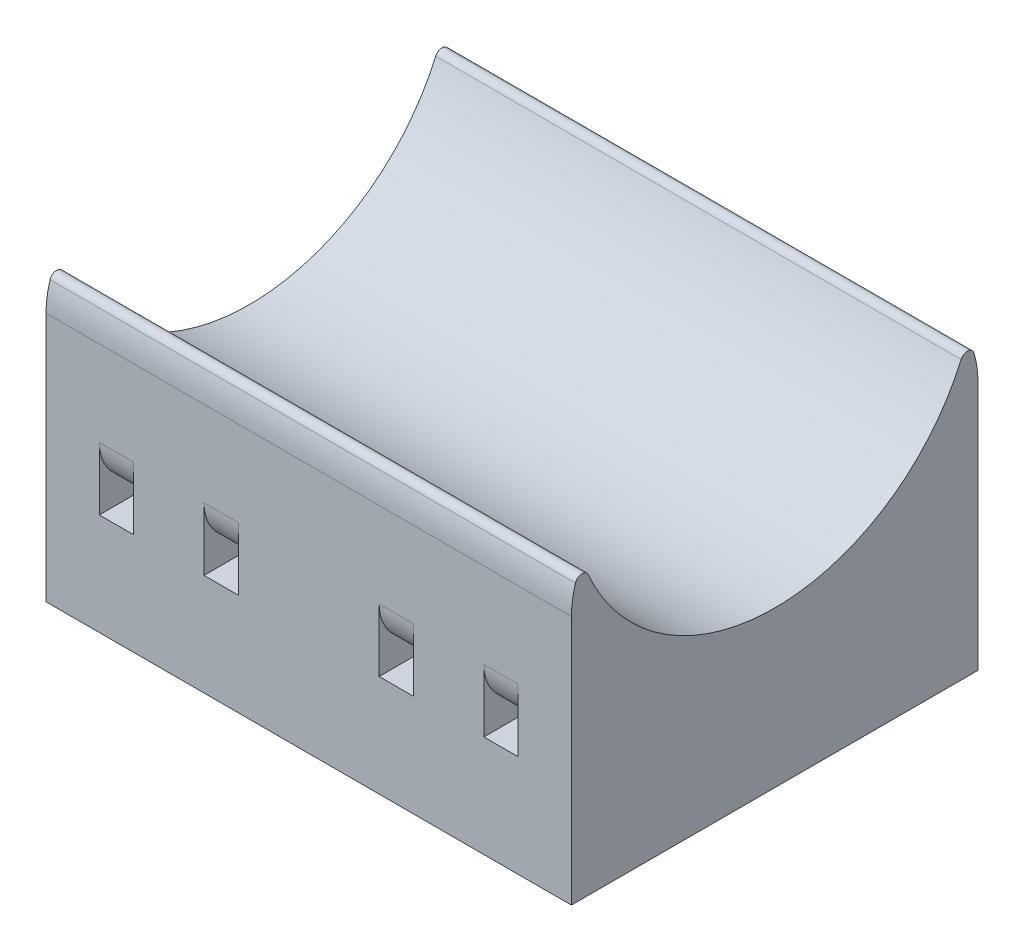
ISO-10303-21;
HEADER;
FILE_DESCRIPTION(('STEP AP214'),'2;1');
FILE_NAME('part.step','',(''),(''),'','','');
FILE_SCHEMA(('AUTOMOTIVE_DESIGN { 1 0 10303 214 1 1 1 1 }'));
ENDSEC;
DATA;
#1=APPLICATION_CONTEXT('core data for automotive mechanical design processes');
#2=APPLICATION_PROTOCOL_DEFINITION('international standard','automotive_design',2000,#1);
#3=PRODUCT_CONTEXT('',#1,'mechanical');
#4=PRODUCT('Part','Part','',(#3));
#5=PRODUCT_RELATED_PRODUCT_CATEGORY('part','',(#4));
#6=PRODUCT_DEFINITION_FORMATION('','',#4);
#7=PRODUCT_DEFINITION_CONTEXT('part definition',#1,'design');
#8=PRODUCT_DEFINITION('design','',#6,#7);
#9=PRODUCT_DEFINITION_SHAPE('','',#8);
#10=(LENGTH_UNIT() NAMED_UNIT(*) SI_UNIT(.MILLI.,.METRE.));
#11=(NAMED_UNIT(*) PLANE_ANGLE_UNIT() SI_UNIT($,.RADIAN.));
#12=(NAMED_UNIT(*) SI_UNIT($,.STERADIAN.) SOLID_ANGLE_UNIT());
#13=UNCERTAINTY_MEASURE_WITH_UNIT(LENGTH_MEASURE(1.E-05),#10,'distance_accuracy_value','');
#14=(GEOMETRIC_REPRESENTATION_CONTEXT(3) GLOBAL_UNCERTAINTY_ASSIGNED_CONTEXT((#13)) GLOBAL_UNIT_ASSIGNED_CONTEXT((#10,
#11,#12)) REPRESENTATION_CONTEXT('',''));
#15=CARTESIAN_POINT('',(0.,0.,0.));
#16=DIRECTION('',(0.,0.,1.));
#17=DIRECTION('',(1.,0.,0.));
#18=AXIS2_PLACEMENT_3D('',#15,#16,#17);
#19=CARTESIAN_POINT('',(23.,32.,17.8));
#20=DIRECTION('',(-1.,0.,0.));
#21=DIRECTION('',(0.,0.,1.));
#22=AXIS2_PLACEMENT_3D('',#19,#20,#21);
#23=PLANE('',#22);
#24=CARTESIAN_POINT('',(23.,31.4346355377257,0.));
#25=DIRECTION('',(1.,0.,0.));
#26=DIRECTION('',(0.,0.,-1.));
#27=AXIS2_PLACEMENT_3D('',#24,#25,#26);
#28=CIRCLE('',#27,17.8089763034039);
#29=CARTESIAN_POINT('',(23.,24.3081878495569,16.3209491244534));
#30=VERTEX_POINT('',#29);
#31=CARTESIAN_POINT('',(23.,24.3081878495569,-16.3209491244534));
#32=VERTEX_POINT('',#31);
#33=EDGE_CURVE('E404',#30,#32,#28,.T.);
#34=ORIENTED_EDGE('',*,*,#33,.F.);
#35=CARTESIAN_POINT('',(23.,24.0680915891063,16.8708161863125));
#36=DIRECTION('',(-1.,0.,0.));
#37=DIRECTION('',(0.,0.,1.));
#38=AXIS2_PLACEMENT_3D('',#35,#36,#37);
#39=CIRCLE('',#38,0.6);
#40=CARTESIAN_POINT('',(23.,24.2450557333627,17.4441256068244));
#41=VERTEX_POINT('',#40);
#42=EDGE_CURVE('E583',#30,#41,#39,.F.);
#43=ORIENTED_EDGE('',*,*,#42,.T.);
#44=CARTESIAN_POINT('',(23.,21.8855338099443,9.8));
#45=DIRECTION('',(-1.,0.,0.));
#46=DIRECTION('',(0.,0.,1.));
#47=AXIS2_PLACEMENT_3D('',#44,#45,#46);
#48=CIRCLE('',#47,8.);
#49=CARTESIAN_POINT('',(23.,21.8855338099443,17.8));
#50=VERTEX_POINT('',#49);
#51=EDGE_CURVE('E557',#41,#50,#48,.F.);
#52=ORIENTED_EDGE('',*,*,#51,.T.);
#53=DIRECTION('',(0.,-1.,0.));
#54=VECTOR('',#53,1.);
#55=CARTESIAN_POINT('',(23.,32.,17.8));
#56=LINE('',#55,#54);
#57=CARTESIAN_POINT('',(23.,0.,17.8));
#58=VERTEX_POINT('',#57);
#59=EDGE_CURVE('E424',#50,#58,#56,.T.);
#60=ORIENTED_EDGE('',*,*,#59,.T.);
#61=DIRECTION('',(0.,0.,-1.));
#62=VECTOR('',#61,1.);
#63=CARTESIAN_POINT('',(23.,0.,17.8));
#64=LINE('',#63,#62);
#65=CARTESIAN_POINT('',(23.,0.,-17.8));
#66=VERTEX_POINT('',#65);
#67=EDGE_CURVE('E408',#58,#66,#64,.T.);
#68=ORIENTED_EDGE('',*,*,#67,.T.);
#69=DIRECTION('',(0.,-1.,0.));
#70=VECTOR('',#69,1.);
#71=CARTESIAN_POINT('',(23.,32.,-17.8));
#72=LINE('',#71,#70);
#73=CARTESIAN_POINT('',(23.,21.8855338099443,-17.8));
#74=VERTEX_POINT('',#73);
#75=EDGE_CURVE('E433',#74,#66,#72,.T.);
#76=ORIENTED_EDGE('',*,*,#75,.F.);
#77=CARTESIAN_POINT('',(23.,21.8855338099443,-9.8));
#78=DIRECTION('',(-1.,0.,0.));
#79=DIRECTION('',(0.,0.,1.));
#80=AXIS2_PLACEMENT_3D('',#77,#78,#79);
#81=CIRCLE('',#80,8.);
#82=CARTESIAN_POINT('',(23.,24.2450557333627,-17.4441256068244));
#83=VERTEX_POINT('',#82);
#84=EDGE_CURVE('E553',#74,#83,#81,.F.);
#85=ORIENTED_EDGE('',*,*,#84,.T.);
#86=CARTESIAN_POINT('',(23.,24.0680915891063,-16.8708161863125));
#87=DIRECTION('',(-1.,0.,0.));
#88=DIRECTION('',(0.,0.,1.));
#89=AXIS2_PLACEMENT_3D('',#86,#87,#88);
#90=CIRCLE('',#89,0.6);
#91=EDGE_CURVE('E580',#83,#32,#90,.F.);
#92=ORIENTED_EDGE('',*,*,#91,.T.);
#93=EDGE_LOOP('',(#34,#43,#52,#60,#68,#76,#85,#92));
#94=FACE_BOUND('',#93,.T.);
#95=ADVANCED_FACE('F39',(#94),#23,.F.);
#96=CARTESIAN_POINT('',(-23.,32.,-17.8));
#97=DIRECTION('',(0.,0.,1.));
#98=DIRECTION('',(1.,0.,0.));
#99=AXIS2_PLACEMENT_3D('',#96,#97,#98);
#100=PLANE('',#99);
#101=DIRECTION('',(0.,-1.,0.));
#102=VECTOR('',#101,1.);
#103=CARTESIAN_POINT('',(18.3333333333333,8.91780149994052,-17.8));
#104=LINE('',#103,#102);
#105=CARTESIAN_POINT('',(18.3333333333333,14.4178014999405,-17.8));
#106=VERTEX_POINT('',#105);
#107=CARTESIAN_POINT('',(18.3333333333333,8.91780149994052,-17.8));
#108=VERTEX_POINT('',#107);
#109=EDGE_CURVE('E267',#106,#108,#104,.T.);
#110=ORIENTED_EDGE('',*,*,#109,.F.);
#111=DIRECTION('',(1.,0.,0.));
#112=VECTOR('',#111,1.);
#113=CARTESIAN_POINT('',(-23.,14.4178014999405,-17.8));
#114=LINE('',#113,#112);
#115=CARTESIAN_POINT('',(15.3333333333333,14.4178014999405,-17.8));
#116=VERTEX_POINT('',#115);
#117=EDGE_CURVE('E484',#106,#116,#114,.F.);
#118=ORIENTED_EDGE('',*,*,#117,.T.);
#119=DIRECTION('',(0.,1.,0.));
#120=VECTOR('',#119,1.);
#121=CARTESIAN_POINT('',(15.3333333333333,8.91780149994052,-17.8));
#122=LINE('',#121,#120);
#123=CARTESIAN_POINT('',(15.3333333333333,8.91780149994052,-17.8));
#124=VERTEX_POINT('',#123);
#125=EDGE_CURVE('E275',#124,#116,#122,.T.);
#126=ORIENTED_EDGE('',*,*,#125,.F.);
#127=DIRECTION('',(-1.,0.,0.));
#128=VECTOR('',#127,1.);
#129=CARTESIAN_POINT('',(18.3333333333333,8.91780149994052,-17.8));
#130=LINE('',#129,#128);
#131=EDGE_CURVE('E256',#108,#124,#130,.T.);
#132=ORIENTED_EDGE('',*,*,#131,.F.);
#133=EDGE_LOOP('',(#110,#118,#126,#132));
#134=FACE_BOUND('',#133,.T.);
#135=DIRECTION('',(0.,-1.,0.));
#136=VECTOR('',#135,1.);
#137=CARTESIAN_POINT('',(9.16666666666667,8.91780149994052,-17.8));
#138=LINE('',#137,#136);
#139=CARTESIAN_POINT('',(9.16666666666667,14.4178014999405,-17.8));
#140=VERTEX_POINT('',#139);
#141=CARTESIAN_POINT('',(9.16666666666667,8.91780149994052,-17.8));
#142=VERTEX_POINT('',#141);
#143=EDGE_CURVE('E307',#140,#142,#138,.T.);
#144=ORIENTED_EDGE('',*,*,#143,.F.);
#145=DIRECTION('',(1.,0.,0.));
#146=VECTOR('',#145,1.);
#147=CARTESIAN_POINT('',(-23.,14.4178014999405,-17.8));
#148=LINE('',#147,#146);
#149=CARTESIAN_POINT('',(6.16666666666667,14.4178014999405,-17.8));
#150=VERTEX_POINT('',#149);
#151=EDGE_CURVE('E487',#140,#150,#148,.F.);
#152=ORIENTED_EDGE('',*,*,#151,.T.);
#153=DIRECTION('',(0.,1.,0.));
#154=VECTOR('',#153,1.);
#155=CARTESIAN_POINT('',(6.16666666666667,8.91780149994052,-17.8));
#156=LINE('',#155,#154);
#157=CARTESIAN_POINT('',(6.16666666666667,8.91780149994052,-17.8));
#158=VERTEX_POINT('',#157);
#159=EDGE_CURVE('E304',#158,#150,#156,.T.);
#160=ORIENTED_EDGE('',*,*,#159,.F.);
#161=DIRECTION('',(-1.,0.,0.));
#162=VECTOR('',#161,1.);
#163=CARTESIAN_POINT('',(9.16666666666667,8.91780149994052,-17.8));
#164=LINE('',#163,#162);
#165=EDGE_CURVE('E311',#142,#158,#164,.T.);
#166=ORIENTED_EDGE('',*,*,#165,.F.);
#167=EDGE_LOOP('',(#144,#152,#160,#166));
#168=FACE_BOUND('',#167,.T.);
#169=DIRECTION('',(0.,-1.,0.));
#170=VECTOR('',#169,1.);
#171=CARTESIAN_POINT('',(-6.16666666666667,8.91780149994052,-17.8));
#172=LINE('',#171,#170);
#173=CARTESIAN_POINT('',(-6.16666666666667,14.4178014999405,-17.8));
#174=VERTEX_POINT('',#173);
#175=CARTESIAN_POINT('',(-6.16666666666667,8.91780149994052,-17.8));
#176=VERTEX_POINT('',#175);
#177=EDGE_CURVE('E345',#174,#176,#172,.T.);
#178=ORIENTED_EDGE('',*,*,#177,.F.);
#179=DIRECTION('',(1.,0.,0.));
#180=VECTOR('',#179,1.);
#181=CARTESIAN_POINT('',(-23.,14.4178014999405,-17.8));
#182=LINE('',#181,#180);
#183=CARTESIAN_POINT('',(-9.16666666666667,14.4178014999405,-17.8));
#184=VERTEX_POINT('',#183);
#185=EDGE_CURVE('E491',#174,#184,#182,.F.);
#186=ORIENTED_EDGE('',*,*,#185,.T.);
#187=DIRECTION('',(0.,1.,0.));
#188=VECTOR('',#187,1.);
#189=CARTESIAN_POINT('',(-9.16666666666667,8.91780149994052,-17.8));
#190=LINE('',#189,#188);
#191=CARTESIAN_POINT('',(-9.16666666666667,8.91780149994052,-17.8));
#192=VERTEX_POINT('',#191);
#193=EDGE_CURVE('E342',#192,#184,#190,.T.);
#194=ORIENTED_EDGE('',*,*,#193,.F.);
#195=DIRECTION('',(-1.,0.,0.));
#196=VECTOR('',#195,1.);
#197=CARTESIAN_POINT('',(-9.16666666666667,8.91780149994052,-17.8));
#198=LINE('',#197,#196);
#199=EDGE_CURVE('E349',#176,#192,#198,.T.);
#200=ORIENTED_EDGE('',*,*,#199,.F.);
#201=EDGE_LOOP('',(#178,#186,#194,#200));
#202=FACE_BOUND('',#201,.T.);
#203=DIRECTION('',(0.,-1.,0.));
#204=VECTOR('',#203,1.);
#205=CARTESIAN_POINT('',(-15.3333333333333,8.91780149994052,-17.8));
#206=LINE('',#205,#204);
#207=CARTESIAN_POINT('',(-15.3333333333333,14.4178014999405,-17.8));
#208=VERTEX_POINT('',#207);
#209=CARTESIAN_POINT('',(-15.3333333333333,8.91780149994052,-17.8));
#210=VERTEX_POINT('',#209);
#211=EDGE_CURVE('E380',#208,#210,#206,.T.);
#212=ORIENTED_EDGE('',*,*,#211,.F.);
#213=DIRECTION('',(1.,0.,0.));
#214=VECTOR('',#213,1.);
#215=CARTESIAN_POINT('',(-23.,14.4178014999405,-17.8));
#216=LINE('',#215,#214);
#217=CARTESIAN_POINT('',(-18.3333333333333,14.4178014999405,-17.8));
#218=VERTEX_POINT('',#217);
#219=EDGE_CURVE('E495',#208,#218,#216,.F.);
#220=ORIENTED_EDGE('',*,*,#219,.T.);
#221=DIRECTION('',(0.,1.,0.));
#222=VECTOR('',#221,1.);
#223=CARTESIAN_POINT('',(-18.3333333333333,8.91780149994052,-17.8));
#224=LINE('',#223,#222);
#225=CARTESIAN_POINT('',(-18.3333333333333,8.91780149994052,-17.8));
#226=VERTEX_POINT('',#225);
#227=EDGE_CURVE('E377',#226,#218,#224,.T.);
#228=ORIENTED_EDGE('',*,*,#227,.F.);
#229=DIRECTION('',(-1.,0.,0.));
#230=VECTOR('',#229,1.);
#231=CARTESIAN_POINT('',(-18.3333333333333,8.91780149994052,-17.8));
#232=LINE('',#231,#230);
#233=EDGE_CURVE('E384',#210,#226,#232,.T.);
#234=ORIENTED_EDGE('',*,*,#233,.F.);
#235=EDGE_LOOP('',(#212,#220,#228,#234));
#236=FACE_BOUND('',#235,.T.);
#237=DIRECTION('',(0.,-1.,0.));
#238=VECTOR('',#237,1.);
#239=CARTESIAN_POINT('',(-23.,32.,-17.8));
#240=LINE('',#239,#238);
#241=CARTESIAN_POINT('',(-23.,21.8855338099443,-17.8));
#242=VERTEX_POINT('',#241);
#243=CARTESIAN_POINT('',(-23.,0.,-17.8));
#244=VERTEX_POINT('',#243);
#245=EDGE_CURVE('E430',#242,#244,#240,.T.);
#246=ORIENTED_EDGE('',*,*,#245,.F.);
#247=DIRECTION('',(1.,0.,0.));
#248=VECTOR('',#247,1.);
#249=CARTESIAN_POINT('',(-23.,21.8855338099443,-17.8));
#250=LINE('',#249,#248);
#251=EDGE_CURVE('E569',#242,#74,#250,.T.);
#252=ORIENTED_EDGE('',*,*,#251,.T.);
#253=ORIENTED_EDGE('',*,*,#75,.T.);
#254=DIRECTION('',(-1.,0.,0.));
#255=VECTOR('',#254,1.);
#256=CARTESIAN_POINT('',(-23.,0.,-17.8));
#257=LINE('',#256,#255);
#258=EDGE_CURVE('E412',#66,#244,#257,.T.);
#259=ORIENTED_EDGE('',*,*,#258,.T.);
#260=EDGE_LOOP('',(#246,#252,#253,#259));
#261=FACE_BOUND('',#260,.T.);
#262=ADVANCED_FACE('F277',(#134,#168,#202,#236,#261),#100,.F.);
#263=CARTESIAN_POINT('',(-23.,32.,17.8));
#264=DIRECTION('',(1.,0.,0.));
#265=DIRECTION('',(0.,0.,-1.));
#266=AXIS2_PLACEMENT_3D('',#263,#264,#265);
#267=PLANE('',#266);
#268=CARTESIAN_POINT('',(-23.,21.8855338099443,9.8));
#269=DIRECTION('',(1.,0.,0.));
#270=DIRECTION('',(0.,0.,-1.));
#271=AXIS2_PLACEMENT_3D('',#268,#269,#270);
#272=CIRCLE('',#271,8.);
#273=CARTESIAN_POINT('',(-23.,21.8855338099443,17.8));
#274=VERTEX_POINT('',#273);
#275=CARTESIAN_POINT('',(-23.,24.2450557333627,17.4441256068244));
#276=VERTEX_POINT('',#275);
#277=EDGE_CURVE('E566',#274,#276,#272,.F.);
#278=ORIENTED_EDGE('',*,*,#277,.T.);
#279=CARTESIAN_POINT('',(-23.,24.0680915891063,16.8708161863125));
#280=DIRECTION('',(1.,0.,0.));
#281=DIRECTION('',(0.,0.,-1.));
#282=AXIS2_PLACEMENT_3D('',#279,#280,#281);
#283=CIRCLE('',#282,0.6);
#284=CARTESIAN_POINT('',(-23.,24.3081878495569,16.3209491244534));
#285=VERTEX_POINT('',#284);
#286=EDGE_CURVE('E48',#276,#285,#283,.F.);
#287=ORIENTED_EDGE('',*,*,#286,.T.);
#288=CARTESIAN_POINT('',(-23.,31.4346355377257,0.));
#289=DIRECTION('',(1.,0.,0.));
#290=DIRECTION('',(0.,0.,-1.));
#291=AXIS2_PLACEMENT_3D('',#288,#289,#290);
#292=CIRCLE('',#291,17.8089763034039);
#293=CARTESIAN_POINT('',(-23.,24.3081878495569,-16.3209491244534));
#294=VERTEX_POINT('',#293);
#295=EDGE_CURVE('E288',#294,#285,#292,.F.);
#296=ORIENTED_EDGE('',*,*,#295,.F.);
#297=CARTESIAN_POINT('',(-23.,24.0680915891063,-16.8708161863125));
#298=DIRECTION('',(1.,0.,0.));
#299=DIRECTION('',(0.,0.,-1.));
#300=AXIS2_PLACEMENT_3D('',#297,#298,#299);
#301=CIRCLE('',#300,0.6);
#302=CARTESIAN_POINT('',(-23.,24.2450557333627,-17.4441256068244));
#303=VERTEX_POINT('',#302);
#304=EDGE_CURVE('E55',#294,#303,#301,.F.);
#305=ORIENTED_EDGE('',*,*,#304,.T.);
#306=CARTESIAN_POINT('',(-23.,21.8855338099443,-9.8));
#307=DIRECTION('',(1.,0.,0.));
#308=DIRECTION('',(0.,0.,-1.));
#309=AXIS2_PLACEMENT_3D('',#306,#307,#308);
#310=CIRCLE('',#309,8.);
#311=EDGE_CURVE('E563',#303,#242,#310,.F.);
#312=ORIENTED_EDGE('',*,*,#311,.T.);
#313=ORIENTED_EDGE('',*,*,#245,.T.);
#314=DIRECTION('',(0.,0.,1.));
#315=VECTOR('',#314,1.);
#316=CARTESIAN_POINT('',(-23.,0.,17.8));
#317=LINE('',#316,#315);
#318=CARTESIAN_POINT('',(-23.,0.,17.8));
#319=VERTEX_POINT('',#318);
#320=EDGE_CURVE('E416',#244,#319,#317,.T.);
#321=ORIENTED_EDGE('',*,*,#320,.T.);
#322=DIRECTION('',(0.,-1.,0.));
#323=VECTOR('',#322,1.);
#324=CARTESIAN_POINT('',(-23.,32.,17.8));
#325=LINE('',#324,#323);
#326=EDGE_CURVE('E427',#274,#319,#325,.T.);
#327=ORIENTED_EDGE('',*,*,#326,.F.);
#328=EDGE_LOOP('',(#278,#287,#296,#305,#312,#313,#321,#327));
#329=FACE_BOUND('',#328,.T.);
#330=ADVANCED_FACE('F591',(#329),#267,.F.);
#331=CARTESIAN_POINT('',(-23.,32.,17.8));
#332=DIRECTION('',(0.,0.,-1.));
#333=DIRECTION('',(-1.,0.,0.));
#334=AXIS2_PLACEMENT_3D('',#331,#332,#333);
#335=PLANE('',#334);
#336=DIRECTION('',(0.,-1.,0.));
#337=VECTOR('',#336,1.);
#338=CARTESIAN_POINT('',(15.3333333333333,8.91780149994052,17.8));
#339=LINE('',#338,#337);
#340=CARTESIAN_POINT('',(15.3333333333333,14.4178014999405,17.8));
#341=VERTEX_POINT('',#340);
#342=CARTESIAN_POINT('',(15.3333333333333,8.91780149994052,17.8));
#343=VERTEX_POINT('',#342);
#344=EDGE_CURVE('E937',#341,#343,#339,.T.);
#345=ORIENTED_EDGE('',*,*,#344,.F.);
#346=DIRECTION('',(-1.,0.,0.));
#347=VECTOR('',#346,1.);
#348=CARTESIAN_POINT('',(-23.,14.4178014999405,17.8));
#349=LINE('',#348,#347);
#350=CARTESIAN_POINT('',(18.3333333333333,14.4178014999405,17.8));
#351=VERTEX_POINT('',#350);
#352=EDGE_CURVE('E452',#341,#351,#349,.F.);
#353=ORIENTED_EDGE('',*,*,#352,.T.);
#354=DIRECTION('',(0.,1.,0.));
#355=VECTOR('',#354,1.);
#356=CARTESIAN_POINT('',(18.3333333333333,8.91780149994052,17.8));
#357=LINE('',#356,#355);
#358=CARTESIAN_POINT('',(18.3333333333333,8.91780149994052,17.8));
#359=VERTEX_POINT('',#358);
#360=EDGE_CURVE('E319',#359,#351,#357,.T.);
#361=ORIENTED_EDGE('',*,*,#360,.F.);
#362=DIRECTION('',(1.,0.,0.));
#363=VECTOR('',#362,1.);
#364=CARTESIAN_POINT('',(18.3333333333333,8.91780149994052,17.8));
#365=LINE('',#364,#363);
#366=EDGE_CURVE('E259',#343,#359,#365,.T.);
#367=ORIENTED_EDGE('',*,*,#366,.F.);
#368=EDGE_LOOP('',(#345,#353,#361,#367));
#369=FACE_BOUND('',#368,.T.);
#370=DIRECTION('',(0.,-1.,0.));
#371=VECTOR('',#370,1.);
#372=CARTESIAN_POINT('',(6.16666666666667,8.91780149994052,17.8));
#373=LINE('',#372,#371);
#374=CARTESIAN_POINT('',(6.16666666666667,14.4178014999405,17.8));
#375=VERTEX_POINT('',#374);
#376=CARTESIAN_POINT('',(6.16666666666667,8.91780149994052,17.8));
#377=VERTEX_POINT('',#376);
#378=EDGE_CURVE('E300',#375,#377,#373,.T.);
#379=ORIENTED_EDGE('',*,*,#378,.F.);
#380=DIRECTION('',(-1.,0.,0.));
#381=VECTOR('',#380,1.);
#382=CARTESIAN_POINT('',(-23.,14.4178014999405,17.8));
#383=LINE('',#382,#381);
#384=CARTESIAN_POINT('',(9.16666666666667,14.4178014999405,17.8));
#385=VERTEX_POINT('',#384);
#386=EDGE_CURVE('E456',#375,#385,#383,.F.);
#387=ORIENTED_EDGE('',*,*,#386,.T.);
#388=DIRECTION('',(0.,1.,0.));
#389=VECTOR('',#388,1.);
#390=CARTESIAN_POINT('',(9.16666666666667,8.91780149994052,17.8));
#391=LINE('',#390,#389);
#392=CARTESIAN_POINT('',(9.16666666666667,8.91780149994052,17.8));
#393=VERTEX_POINT('',#392);
#394=EDGE_CURVE('E292',#393,#385,#391,.T.);
#395=ORIENTED_EDGE('',*,*,#394,.F.);
#396=DIRECTION('',(1.,0.,0.));
#397=VECTOR('',#396,1.);
#398=CARTESIAN_POINT('',(9.16666666666667,8.91780149994052,17.8));
#399=LINE('',#398,#397);
#400=EDGE_CURVE('E295',#377,#393,#399,.T.);
#401=ORIENTED_EDGE('',*,*,#400,.F.);
#402=EDGE_LOOP('',(#379,#387,#395,#401));
#403=FACE_BOUND('',#402,.T.);
#404=DIRECTION('',(0.,-1.,0.));
#405=VECTOR('',#404,1.);
#406=CARTESIAN_POINT('',(-9.16666666666667,8.91780149994052,17.8));
#407=LINE('',#406,#405);
#408=CARTESIAN_POINT('',(-9.16666666666667,14.4178014999405,17.8));
#409=VERTEX_POINT('',#408);
#410=CARTESIAN_POINT('',(-9.16666666666667,8.91780149994052,17.8));
#411=VERTEX_POINT('',#410);
#412=EDGE_CURVE('E338',#409,#411,#407,.T.);
#413=ORIENTED_EDGE('',*,*,#412,.F.);
#414=DIRECTION('',(-1.,0.,0.));
#415=VECTOR('',#414,1.);
#416=CARTESIAN_POINT('',(-23.,14.4178014999405,17.8));
#417=LINE('',#416,#415);
#418=CARTESIAN_POINT('',(-6.16666666666667,14.4178014999405,17.8));
#419=VERTEX_POINT('',#418);
#420=EDGE_CURVE('E448',#409,#419,#417,.F.);
#421=ORIENTED_EDGE('',*,*,#420,.T.);
#422=DIRECTION('',(0.,1.,0.));
#423=VECTOR('',#422,1.);
#424=CARTESIAN_POINT('',(-6.16666666666667,8.91780149994052,17.8));
#425=LINE('',#424,#423);
#426=CARTESIAN_POINT('',(-6.16666666666667,8.91780149994052,17.8));
#427=VERTEX_POINT('',#426);
#428=EDGE_CURVE('E330',#427,#419,#425,.T.);
#429=ORIENTED_EDGE('',*,*,#428,.F.);
#430=DIRECTION('',(1.,0.,0.));
#431=VECTOR('',#430,1.);
#432=CARTESIAN_POINT('',(-9.16666666666667,8.91780149994052,17.8));
#433=LINE('',#432,#431);
#434=EDGE_CURVE('E333',#411,#427,#433,.T.);
#435=ORIENTED_EDGE('',*,*,#434,.F.);
#436=EDGE_LOOP('',(#413,#421,#429,#435));
#437=FACE_BOUND('',#436,.T.);
#438=DIRECTION('',(0.,-1.,0.));
#439=VECTOR('',#438,1.);
#440=CARTESIAN_POINT('',(-18.3333333333333,8.91780149994052,17.8));
#441=LINE('',#440,#439);
#442=CARTESIAN_POINT('',(-18.3333333333333,14.4178014999405,17.8));
#443=VERTEX_POINT('',#442);
#444=CARTESIAN_POINT('',(-18.3333333333333,8.91780149994052,17.8));
#445=VERTEX_POINT('',#444);
#446=EDGE_CURVE('E373',#443,#445,#441,.T.);
#447=ORIENTED_EDGE('',*,*,#446,.F.);
#448=DIRECTION('',(-1.,0.,0.));
#449=VECTOR('',#448,1.);
#450=CARTESIAN_POINT('',(-23.,14.4178014999405,17.8));
#451=LINE('',#450,#449);
#452=CARTESIAN_POINT('',(-15.3333333333333,14.4178014999405,17.8));
#453=VERTEX_POINT('',#452);
#454=EDGE_CURVE('E444',#443,#453,#451,.F.);
#455=ORIENTED_EDGE('',*,*,#454,.T.);
#456=DIRECTION('',(0.,1.,0.));
#457=VECTOR('',#456,1.);
#458=CARTESIAN_POINT('',(-15.3333333333333,8.91780149994052,17.8));
#459=LINE('',#458,#457);
#460=CARTESIAN_POINT('',(-15.3333333333333,8.91780149994052,17.8));
#461=VERTEX_POINT('',#460);
#462=EDGE_CURVE('E366',#461,#453,#459,.T.);
#463=ORIENTED_EDGE('',*,*,#462,.F.);
#464=DIRECTION('',(1.,0.,0.));
#465=VECTOR('',#464,1.);
#466=CARTESIAN_POINT('',(-18.3333333333333,8.91780149994052,17.8));
#467=LINE('',#466,#465);
#468=EDGE_CURVE('E369',#445,#461,#467,.T.);
#469=ORIENTED_EDGE('',*,*,#468,.F.);
#470=EDGE_LOOP('',(#447,#455,#463,#469));
#471=FACE_BOUND('',#470,.T.);
#472=ORIENTED_EDGE('',*,*,#59,.F.);
#473=DIRECTION('',(1.,0.,0.));
#474=VECTOR('',#473,1.);
#475=CARTESIAN_POINT('',(-23.,21.8855338099443,17.8));
#476=LINE('',#475,#474);
#477=EDGE_CURVE('E560',#50,#274,#476,.F.);
#478=ORIENTED_EDGE('',*,*,#477,.T.);
#479=ORIENTED_EDGE('',*,*,#326,.T.);
#480=DIRECTION('',(1.,0.,0.));
#481=VECTOR('',#480,1.);
#482=CARTESIAN_POINT('',(-23.,0.,17.8));
#483=LINE('',#482,#481);
#484=EDGE_CURVE('E420',#319,#58,#483,.T.);
#485=ORIENTED_EDGE('',*,*,#484,.T.);
#486=EDGE_LOOP('',(#472,#478,#479,#485));
#487=FACE_BOUND('',#486,.T.);
#488=ADVANCED_FACE('F605',(#369,#403,#437,#471,#487),#335,.F.);
#489=CARTESIAN_POINT('',(0.,0.,0.));
#490=DIRECTION('',(0.,-1.,0.));
#491=DIRECTION('',(0.,0.,-1.));
#492=AXIS2_PLACEMENT_3D('',#489,#490,#491);
#493=PLANE('',#492);
#494=ORIENTED_EDGE('',*,*,#67,.F.);
#495=ORIENTED_EDGE('',*,*,#484,.F.);
#496=ORIENTED_EDGE('',*,*,#320,.F.);
#497=ORIENTED_EDGE('',*,*,#258,.F.);
#498=EDGE_LOOP('',(#494,#495,#496,#497));
#499=FACE_BOUND('',#498,.T.);
#500=ADVANCED_FACE('F612',(#499),#493,.T.);
#501=CARTESIAN_POINT('',(-23.001,31.4346355377257,0.));
#502=DIRECTION('',(1.,0.,0.));
#503=DIRECTION('',(0.,0.,-1.));
#504=AXIS2_PLACEMENT_3D('',#501,#502,#503);
#505=CYLINDRICAL_SURFACE('',#504,17.8089763034039);
#506=ORIENTED_EDGE('',*,*,#295,.T.);
#507=DIRECTION('',(1.,0.,0.));
#508=VECTOR('',#507,1.);
#509=CARTESIAN_POINT('',(-23.001,24.3081878495569,16.3209491244534));
#510=LINE('',#509,#508);
#511=EDGE_CURVE('E576',#285,#30,#510,.T.);
#512=ORIENTED_EDGE('',*,*,#511,.T.);
#513=ORIENTED_EDGE('',*,*,#33,.T.);
#514=DIRECTION('',(1.,0.,0.));
#515=VECTOR('',#514,1.);
#516=CARTESIAN_POINT('',(-23.001,24.3081878495569,-16.3209491244534));
#517=LINE('',#516,#515);
#518=EDGE_CURVE('E573',#32,#294,#517,.F.);
#519=ORIENTED_EDGE('',*,*,#518,.T.);
#520=EDGE_LOOP('',(#506,#512,#513,#519));
#521=FACE_BOUND('',#520,.T.);
#522=ADVANCED_FACE('F596',(#521),#505,.F.);
#523=CARTESIAN_POINT('',(-18.3333333333333,8.91780149994052,17.801));
#524=DIRECTION('',(-1.,0.,0.));
#525=DIRECTION('',(0.,0.,1.));
#526=AXIS2_PLACEMENT_3D('',#523,#524,#525);
#527=PLANE('',#526);
#528=ORIENTED_EDGE('',*,*,#446,.T.);
#529=DIRECTION('',(0.,0.,-1.));
#530=VECTOR('',#529,1.);
#531=CARTESIAN_POINT('',(-18.3333333333333,8.91780149994052,17.801));
#532=LINE('',#531,#530);
#533=EDGE_CURVE('E334',#445,#226,#532,.T.);
#534=ORIENTED_EDGE('',*,*,#533,.T.);
#535=ORIENTED_EDGE('',*,*,#227,.T.);
#536=CARTESIAN_POINT('',(-18.3333333333333,14.4178014999405,-13.8));
#537=DIRECTION('',(-1.,0.,0.));
#538=DIRECTION('',(0.,0.,1.));
#539=AXIS2_PLACEMENT_3D('',#536,#537,#538);
#540=CIRCLE('',#539,4.);
#541=CARTESIAN_POINT('',(-18.3333333333333,10.4178014999405,-13.8));
#542=VERTEX_POINT('',#541);
#543=EDGE_CURVE('E531',#218,#542,#540,.T.);
#544=ORIENTED_EDGE('',*,*,#543,.T.);
#545=DIRECTION('',(0.,0.,-1.));
#546=VECTOR('',#545,1.);
#547=CARTESIAN_POINT('',(-18.3333333333333,10.4178014999405,17.801));
#548=LINE('',#547,#546);
#549=CARTESIAN_POINT('',(-18.3333333333333,10.4178014999405,13.8));
#550=VERTEX_POINT('',#549);
#551=EDGE_CURVE('E388',#550,#542,#548,.T.);
#552=ORIENTED_EDGE('',*,*,#551,.F.);
#553=CARTESIAN_POINT('',(-18.3333333333333,14.4178014999405,13.8));
#554=DIRECTION('',(-1.,0.,0.));
#555=DIRECTION('',(0.,0.,1.));
#556=AXIS2_PLACEMENT_3D('',#553,#554,#555);
#557=CIRCLE('',#556,4.);
#558=EDGE_CURVE('E520',#550,#443,#557,.T.);
#559=ORIENTED_EDGE('',*,*,#558,.T.);
#560=EDGE_LOOP('',(#528,#534,#535,#544,#552,#559));
#561=FACE_BOUND('',#560,.T.);
#562=ADVANCED_FACE('F861',(#561),#527,.F.);
#563=CARTESIAN_POINT('',(-18.3333333333333,8.91780149994052,17.801));
#564=DIRECTION('',(0.,-1.,0.));
#565=DIRECTION('',(1.,0.,0.));
#566=AXIS2_PLACEMENT_3D('',#563,#564,#565);
#567=PLANE('',#566);
#568=ORIENTED_EDGE('',*,*,#468,.T.);
#569=DIRECTION('',(0.,0.,-1.));
#570=VECTOR('',#569,1.);
#571=CARTESIAN_POINT('',(-15.3333333333333,8.91780149994052,17.801));
#572=LINE('',#571,#570);
#573=EDGE_CURVE('E391',#461,#210,#572,.T.);
#574=ORIENTED_EDGE('',*,*,#573,.T.);
#575=ORIENTED_EDGE('',*,*,#233,.T.);
#576=ORIENTED_EDGE('',*,*,#533,.F.);
#577=EDGE_LOOP('',(#568,#574,#575,#576));
#578=FACE_BOUND('',#577,.T.);
#579=ADVANCED_FACE('F853',(#578),#567,.F.);
#580=CARTESIAN_POINT('',(-15.3333333333333,8.91780149994052,17.801));
#581=DIRECTION('',(1.,0.,0.));
#582=DIRECTION('',(0.,0.,-1.));
#583=AXIS2_PLACEMENT_3D('',#580,#581,#582);
#584=PLANE('',#583);
#585=ORIENTED_EDGE('',*,*,#462,.T.);
#586=CARTESIAN_POINT('',(-15.3333333333333,14.4178014999405,13.8));
#587=DIRECTION('',(1.,0.,0.));
#588=DIRECTION('',(0.,0.,-1.));
#589=AXIS2_PLACEMENT_3D('',#586,#587,#588);
#590=CIRCLE('',#589,4.);
#591=CARTESIAN_POINT('',(-15.3333333333333,10.4178014999405,13.8));
#592=VERTEX_POINT('',#591);
#593=EDGE_CURVE('E524',#453,#592,#590,.T.);
#594=ORIENTED_EDGE('',*,*,#593,.T.);
#595=DIRECTION('',(0.,0.,-1.));
#596=VECTOR('',#595,1.);
#597=CARTESIAN_POINT('',(-15.3333333333333,10.4178014999405,17.801));
#598=LINE('',#597,#596);
#599=CARTESIAN_POINT('',(-15.3333333333333,10.4178014999405,-13.8));
#600=VERTEX_POINT('',#599);
#601=EDGE_CURVE('E394',#592,#600,#598,.T.);
#602=ORIENTED_EDGE('',*,*,#601,.T.);
#603=CARTESIAN_POINT('',(-15.3333333333333,14.4178014999405,-13.8));
#604=DIRECTION('',(1.,0.,0.));
#605=DIRECTION('',(0.,0.,-1.));
#606=AXIS2_PLACEMENT_3D('',#603,#604,#605);
#607=CIRCLE('',#606,4.);
#608=EDGE_CURVE('E527',#600,#208,#607,.T.);
#609=ORIENTED_EDGE('',*,*,#608,.T.);
#610=ORIENTED_EDGE('',*,*,#211,.T.);
#611=ORIENTED_EDGE('',*,*,#573,.F.);
#612=EDGE_LOOP('',(#585,#594,#602,#609,#610,#611));
#613=FACE_BOUND('',#612,.T.);
#614=ADVANCED_FACE('F844',(#613),#584,.F.);
#615=CARTESIAN_POINT('',(-18.3333333333333,10.4178014999405,17.801));
#616=DIRECTION('',(0.,1.,0.));
#617=DIRECTION('',(-1.,0.,0.));
#618=AXIS2_PLACEMENT_3D('',#615,#616,#617);
#619=PLANE('',#618);
#620=ORIENTED_EDGE('',*,*,#601,.F.);
#621=DIRECTION('',(-1.,0.,0.));
#622=VECTOR('',#621,1.);
#623=CARTESIAN_POINT('',(-18.3333333333333,10.4178014999405,13.8));
#624=LINE('',#623,#622);
#625=EDGE_CURVE('E480',#592,#550,#624,.T.);
#626=ORIENTED_EDGE('',*,*,#625,.T.);
#627=ORIENTED_EDGE('',*,*,#551,.T.);
#628=DIRECTION('',(1.,0.,0.));
#629=VECTOR('',#628,1.);
#630=CARTESIAN_POINT('',(-18.3333333333333,10.4178014999405,-13.8));
#631=LINE('',#630,#629);
#632=EDGE_CURVE('E476',#542,#600,#631,.T.);
#633=ORIENTED_EDGE('',*,*,#632,.T.);
#634=EDGE_LOOP('',(#620,#626,#627,#633));
#635=FACE_BOUND('',#634,.T.);
#636=ADVANCED_FACE('F835',(#635),#619,.F.);
#637=CARTESIAN_POINT('',(-9.16666666666667,8.91780149994052,17.801));
#638=DIRECTION('',(-1.,0.,0.));
#639=DIRECTION('',(0.,0.,1.));
#640=AXIS2_PLACEMENT_3D('',#637,#638,#639);
#641=PLANE('',#640);
#642=ORIENTED_EDGE('',*,*,#412,.T.);
#643=DIRECTION('',(0.,0.,-1.));
#644=VECTOR('',#643,1.);
#645=CARTESIAN_POINT('',(-9.16666666666667,8.91780149994052,17.801));
#646=LINE('',#645,#644);
#647=EDGE_CURVE('E296',#411,#192,#646,.T.);
#648=ORIENTED_EDGE('',*,*,#647,.T.);
#649=ORIENTED_EDGE('',*,*,#193,.T.);
#650=CARTESIAN_POINT('',(-9.16666666666667,14.4178014999405,-13.8));
#651=DIRECTION('',(-1.,0.,0.));
#652=DIRECTION('',(0.,0.,1.));
#653=AXIS2_PLACEMENT_3D('',#650,#651,#652);
#654=CIRCLE('',#653,4.);
#655=CARTESIAN_POINT('',(-9.16666666666667,10.4178014999405,-13.8));
#656=VERTEX_POINT('',#655);
#657=EDGE_CURVE('E538',#184,#656,#654,.T.);
#658=ORIENTED_EDGE('',*,*,#657,.T.);
#659=DIRECTION('',(0.,0.,-1.));
#660=VECTOR('',#659,1.);
#661=CARTESIAN_POINT('',(-9.16666666666667,10.4178014999405,17.801));
#662=LINE('',#661,#660);
#663=CARTESIAN_POINT('',(-9.16666666666667,10.4178014999405,13.8));
#664=VERTEX_POINT('',#663);
#665=EDGE_CURVE('E353',#664,#656,#662,.T.);
#666=ORIENTED_EDGE('',*,*,#665,.F.);
#667=CARTESIAN_POINT('',(-9.16666666666667,14.4178014999405,13.8));
#668=DIRECTION('',(-1.,0.,0.));
#669=DIRECTION('',(0.,0.,1.));
#670=AXIS2_PLACEMENT_3D('',#667,#668,#669);
#671=CIRCLE('',#670,4.);
#672=EDGE_CURVE('E513',#664,#409,#671,.T.);
#673=ORIENTED_EDGE('',*,*,#672,.T.);
#674=EDGE_LOOP('',(#642,#648,#649,#658,#666,#673));
#675=FACE_BOUND('',#674,.T.);
#676=ADVANCED_FACE('F826',(#675),#641,.F.);
#677=CARTESIAN_POINT('',(-9.16666666666667,8.91780149994052,17.801));
#678=DIRECTION('',(0.,-1.,0.));
#679=DIRECTION('',(0.,0.,-1.));
#680=AXIS2_PLACEMENT_3D('',#677,#678,#679);
#681=PLANE('',#680);
#682=ORIENTED_EDGE('',*,*,#434,.T.);
#683=DIRECTION('',(0.,0.,-1.));
#684=VECTOR('',#683,1.);
#685=CARTESIAN_POINT('',(-6.16666666666667,8.91780149994052,17.801));
#686=LINE('',#685,#684);
#687=EDGE_CURVE('E356',#427,#176,#686,.T.);
#688=ORIENTED_EDGE('',*,*,#687,.T.);
#689=ORIENTED_EDGE('',*,*,#199,.T.);
#690=ORIENTED_EDGE('',*,*,#647,.F.);
#691=EDGE_LOOP('',(#682,#688,#689,#690));
#692=FACE_BOUND('',#691,.T.);
#693=ADVANCED_FACE('F817',(#692),#681,.F.);
#694=CARTESIAN_POINT('',(-6.16666666666667,8.91780149994052,17.801));
#695=DIRECTION('',(1.,0.,0.));
#696=DIRECTION('',(0.,0.,-1.));
#697=AXIS2_PLACEMENT_3D('',#694,#695,#696);
#698=PLANE('',#697);
#699=ORIENTED_EDGE('',*,*,#428,.T.);
#700=CARTESIAN_POINT('',(-6.16666666666667,14.4178014999405,13.8));
#701=DIRECTION('',(1.,0.,0.));
#702=DIRECTION('',(0.,0.,-1.));
#703=AXIS2_PLACEMENT_3D('',#700,#701,#702);
#704=CIRCLE('',#703,4.);
#705=CARTESIAN_POINT('',(-6.16666666666667,10.4178014999405,13.8));
#706=VERTEX_POINT('',#705);
#707=EDGE_CURVE('E517',#419,#706,#704,.T.);
#708=ORIENTED_EDGE('',*,*,#707,.T.);
#709=DIRECTION('',(0.,0.,-1.));
#710=VECTOR('',#709,1.);
#711=CARTESIAN_POINT('',(-6.16666666666667,10.4178014999405,17.801));
#712=LINE('',#711,#710);
#713=CARTESIAN_POINT('',(-6.16666666666667,10.4178014999405,-13.8));
#714=VERTEX_POINT('',#713);
#715=EDGE_CURVE('E359',#706,#714,#712,.T.);
#716=ORIENTED_EDGE('',*,*,#715,.T.);
#717=CARTESIAN_POINT('',(-6.16666666666667,14.4178014999405,-13.8));
#718=DIRECTION('',(1.,0.,0.));
#719=DIRECTION('',(0.,0.,-1.));
#720=AXIS2_PLACEMENT_3D('',#717,#718,#719);
#721=CIRCLE('',#720,4.);
#722=EDGE_CURVE('E534',#714,#174,#721,.T.);
#723=ORIENTED_EDGE('',*,*,#722,.T.);
#724=ORIENTED_EDGE('',*,*,#177,.T.);
#725=ORIENTED_EDGE('',*,*,#687,.F.);
#726=EDGE_LOOP('',(#699,#708,#716,#723,#724,#725));
#727=FACE_BOUND('',#726,.T.);
#728=ADVANCED_FACE('F808',(#727),#698,.F.);
#729=CARTESIAN_POINT('',(-9.16666666666667,10.4178014999405,17.801));
#730=DIRECTION('',(0.,1.,0.));
#731=DIRECTION('',(0.,0.,1.));
#732=AXIS2_PLACEMENT_3D('',#729,#730,#731);
#733=PLANE('',#732);
#734=ORIENTED_EDGE('',*,*,#715,.F.);
#735=DIRECTION('',(-1.,0.,0.));
#736=VECTOR('',#735,1.);
#737=CARTESIAN_POINT('',(-9.16666666666667,10.4178014999405,13.8));
#738=LINE('',#737,#736);
#739=EDGE_CURVE('E472',#706,#664,#738,.T.);
#740=ORIENTED_EDGE('',*,*,#739,.T.);
#741=ORIENTED_EDGE('',*,*,#665,.T.);
#742=DIRECTION('',(1.,0.,0.));
#743=VECTOR('',#742,1.);
#744=CARTESIAN_POINT('',(-9.16666666666667,10.4178014999405,-13.8));
#745=LINE('',#744,#743);
#746=EDGE_CURVE('E468',#656,#714,#745,.T.);
#747=ORIENTED_EDGE('',*,*,#746,.T.);
#748=EDGE_LOOP('',(#734,#740,#741,#747));
#749=FACE_BOUND('',#748,.T.);
#750=ADVANCED_FACE('F799',(#749),#733,.F.);
#751=CARTESIAN_POINT('',(6.16666666666667,8.91780149994052,17.801));
#752=DIRECTION('',(-1.,0.,0.));
#753=DIRECTION('',(0.,0.,1.));
#754=AXIS2_PLACEMENT_3D('',#751,#752,#753);
#755=PLANE('',#754);
#756=ORIENTED_EDGE('',*,*,#378,.T.);
#757=DIRECTION('',(0.,0.,-1.));
#758=VECTOR('',#757,1.);
#759=CARTESIAN_POINT('',(6.16666666666667,8.91780149994052,17.801));
#760=LINE('',#759,#758);
#761=EDGE_CURVE('E316',#377,#158,#760,.T.);
#762=ORIENTED_EDGE('',*,*,#761,.T.);
#763=ORIENTED_EDGE('',*,*,#159,.T.);
#764=CARTESIAN_POINT('',(6.16666666666667,14.4178014999405,-13.8));
#765=DIRECTION('',(-1.,0.,0.));
#766=DIRECTION('',(0.,0.,1.));
#767=AXIS2_PLACEMENT_3D('',#764,#765,#766);
#768=CIRCLE('',#767,4.);
#769=CARTESIAN_POINT('',(6.16666666666667,10.4178014999405,-13.8));
#770=VERTEX_POINT('',#769);
#771=EDGE_CURVE('E545',#150,#770,#768,.T.);
#772=ORIENTED_EDGE('',*,*,#771,.T.);
#773=DIRECTION('',(0.,0.,-1.));
#774=VECTOR('',#773,1.);
#775=CARTESIAN_POINT('',(6.16666666666667,10.4178014999405,17.801));
#776=LINE('',#775,#774);
#777=CARTESIAN_POINT('',(6.16666666666667,10.4178014999405,13.8));
#778=VERTEX_POINT('',#777);
#779=EDGE_CURVE('E315',#778,#770,#776,.T.);
#780=ORIENTED_EDGE('',*,*,#779,.F.);
#781=CARTESIAN_POINT('',(6.16666666666667,14.4178014999405,13.8));
#782=DIRECTION('',(-1.,0.,0.));
#783=DIRECTION('',(0.,0.,1.));
#784=AXIS2_PLACEMENT_3D('',#781,#782,#783);
#785=CIRCLE('',#784,4.);
#786=EDGE_CURVE('E499',#778,#375,#785,.T.);
#787=ORIENTED_EDGE('',*,*,#786,.T.);
#788=EDGE_LOOP('',(#756,#762,#763,#772,#780,#787));
#789=FACE_BOUND('',#788,.T.);
#790=ADVANCED_FACE('F790',(#789),#755,.F.);
#791=CARTESIAN_POINT('',(9.16666666666667,8.91780149994052,17.801));
#792=DIRECTION('',(0.,-1.,0.));
#793=DIRECTION('',(0.,0.,-1.));
#794=AXIS2_PLACEMENT_3D('',#791,#792,#793);
#795=PLANE('',#794);
#796=ORIENTED_EDGE('',*,*,#400,.T.);
#797=DIRECTION('',(0.,0.,-1.));
#798=VECTOR('',#797,1.);
#799=CARTESIAN_POINT('',(9.16666666666667,8.91780149994052,17.801));
#800=LINE('',#799,#798);
#801=EDGE_CURVE('E320',#393,#142,#800,.T.);
#802=ORIENTED_EDGE('',*,*,#801,.T.);
#803=ORIENTED_EDGE('',*,*,#165,.T.);
#804=ORIENTED_EDGE('',*,*,#761,.F.);
#805=EDGE_LOOP('',(#796,#802,#803,#804));
#806=FACE_BOUND('',#805,.T.);
#807=ADVANCED_FACE('F781',(#806),#795,.F.);
#808=CARTESIAN_POINT('',(9.16666666666667,8.91780149994052,17.801));
#809=DIRECTION('',(1.,0.,0.));
#810=DIRECTION('',(0.,0.,-1.));
#811=AXIS2_PLACEMENT_3D('',#808,#809,#810);
#812=PLANE('',#811);
#813=ORIENTED_EDGE('',*,*,#394,.T.);
#814=CARTESIAN_POINT('',(9.16666666666667,14.4178014999405,13.8));
#815=DIRECTION('',(1.,0.,0.));
#816=DIRECTION('',(0.,0.,-1.));
#817=AXIS2_PLACEMENT_3D('',#814,#815,#816);
#818=CIRCLE('',#817,4.);
#819=CARTESIAN_POINT('',(9.16666666666667,10.4178014999405,13.8));
#820=VERTEX_POINT('',#819);
#821=EDGE_CURVE('E503',#385,#820,#818,.T.);
#822=ORIENTED_EDGE('',*,*,#821,.T.);
#823=DIRECTION('',(0.,0.,-1.));
#824=VECTOR('',#823,1.);
#825=CARTESIAN_POINT('',(9.16666666666667,10.4178014999405,17.801));
#826=LINE('',#825,#824);
#827=CARTESIAN_POINT('',(9.16666666666667,10.4178014999405,-13.8));
#828=VERTEX_POINT('',#827);
#829=EDGE_CURVE('E323',#820,#828,#826,.T.);
#830=ORIENTED_EDGE('',*,*,#829,.T.);
#831=CARTESIAN_POINT('',(9.16666666666667,14.4178014999405,-13.8));
#832=DIRECTION('',(1.,0.,0.));
#833=DIRECTION('',(0.,0.,-1.));
#834=AXIS2_PLACEMENT_3D('',#831,#832,#833);
#835=CIRCLE('',#834,4.);
#836=EDGE_CURVE('E541',#828,#140,#835,.T.);
#837=ORIENTED_EDGE('',*,*,#836,.T.);
#838=ORIENTED_EDGE('',*,*,#143,.T.);
#839=ORIENTED_EDGE('',*,*,#801,.F.);
#840=EDGE_LOOP('',(#813,#822,#830,#837,#838,#839));
#841=FACE_BOUND('',#840,.T.);
#842=ADVANCED_FACE('F772',(#841),#812,.F.);
#843=CARTESIAN_POINT('',(9.16666666666667,10.4178014999405,17.801));
#844=DIRECTION('',(0.,1.,0.));
#845=DIRECTION('',(0.,0.,1.));
#846=AXIS2_PLACEMENT_3D('',#843,#844,#845);
#847=PLANE('',#846);
#848=ORIENTED_EDGE('',*,*,#829,.F.);
#849=DIRECTION('',(-1.,0.,0.));
#850=VECTOR('',#849,1.);
#851=CARTESIAN_POINT('',(9.16666666666667,10.4178014999405,13.8));
#852=LINE('',#851,#850);
#853=EDGE_CURVE('E440',#820,#778,#852,.T.);
#854=ORIENTED_EDGE('',*,*,#853,.T.);
#855=ORIENTED_EDGE('',*,*,#779,.T.);
#856=DIRECTION('',(1.,0.,0.));
#857=VECTOR('',#856,1.);
#858=CARTESIAN_POINT('',(9.16666666666667,10.4178014999405,-13.8));
#859=LINE('',#858,#857);
#860=EDGE_CURVE('E436',#770,#828,#859,.T.);
#861=ORIENTED_EDGE('',*,*,#860,.T.);
#862=EDGE_LOOP('',(#848,#854,#855,#861));
#863=FACE_BOUND('',#862,.T.);
#864=ADVANCED_FACE('F763',(#863),#847,.F.);
#865=CARTESIAN_POINT('',(15.3333333333333,8.91780149994052,17.801));
#866=DIRECTION('',(-1.,0.,0.));
#867=DIRECTION('',(0.,0.,1.));
#868=AXIS2_PLACEMENT_3D('',#865,#866,#867);
#869=PLANE('',#868);
#870=ORIENTED_EDGE('',*,*,#344,.T.);
#871=DIRECTION('',(0.,0.,-1.));
#872=VECTOR('',#871,1.);
#873=CARTESIAN_POINT('',(15.3333333333333,8.91780149994052,17.801));
#874=LINE('',#873,#872);
#875=EDGE_CURVE('E263',#343,#124,#874,.T.);
#876=ORIENTED_EDGE('',*,*,#875,.T.);
#877=ORIENTED_EDGE('',*,*,#125,.T.);
#878=CARTESIAN_POINT('',(15.3333333333333,14.4178014999405,-13.8));
#879=DIRECTION('',(-1.,0.,0.));
#880=DIRECTION('',(0.,0.,1.));
#881=AXIS2_PLACEMENT_3D('',#878,#879,#880);
#882=CIRCLE('',#881,4.);
#883=CARTESIAN_POINT('',(15.3333333333333,10.4178014999405,-13.8));
#884=VERTEX_POINT('',#883);
#885=EDGE_CURVE('E550',#116,#884,#882,.T.);
#886=ORIENTED_EDGE('',*,*,#885,.T.);
#887=DIRECTION('',(0.,0.,-1.));
#888=VECTOR('',#887,1.);
#889=CARTESIAN_POINT('',(15.3333333333333,10.4178014999405,17.801));
#890=LINE('',#889,#888);
#891=CARTESIAN_POINT('',(15.3333333333333,10.4178014999405,13.8));
#892=VERTEX_POINT('',#891);
#893=EDGE_CURVE('E280',#892,#884,#890,.T.);
#894=ORIENTED_EDGE('',*,*,#893,.F.);
#895=CARTESIAN_POINT('',(15.3333333333333,14.4178014999405,13.8));
#896=DIRECTION('',(-1.,0.,0.));
#897=DIRECTION('',(0.,0.,1.));
#898=AXIS2_PLACEMENT_3D('',#895,#896,#897);
#899=CIRCLE('',#898,4.);
#900=EDGE_CURVE('E506',#892,#341,#899,.T.);
#901=ORIENTED_EDGE('',*,*,#900,.T.);
#902=EDGE_LOOP('',(#870,#876,#877,#886,#894,#901));
#903=FACE_BOUND('',#902,.T.);
#904=ADVANCED_FACE('F754',(#903),#869,.F.);
#905=CARTESIAN_POINT('',(18.3333333333333,8.91780149994052,17.801));
#906=DIRECTION('',(0.,-1.,0.));
#907=DIRECTION('',(0.,0.,-1.));
#908=AXIS2_PLACEMENT_3D('',#905,#906,#907);
#909=PLANE('',#908);
#910=ORIENTED_EDGE('',*,*,#366,.T.);
#911=DIRECTION('',(0.,0.,-1.));
#912=VECTOR('',#911,1.);
#913=CARTESIAN_POINT('',(18.3333333333333,8.91780149994052,17.801));
#914=LINE('',#913,#912);
#915=EDGE_CURVE('E252',#359,#108,#914,.T.);
#916=ORIENTED_EDGE('',*,*,#915,.T.);
#917=ORIENTED_EDGE('',*,*,#131,.T.);
#918=ORIENTED_EDGE('',*,*,#875,.F.);
#919=EDGE_LOOP('',(#910,#916,#917,#918));
#920=FACE_BOUND('',#919,.T.);
#921=ADVANCED_FACE('F254',(#920),#909,.F.);
#922=CARTESIAN_POINT('',(18.3333333333333,8.91780149994052,17.801));
#923=DIRECTION('',(1.,0.,0.));
#924=DIRECTION('',(0.,0.,-1.));
#925=AXIS2_PLACEMENT_3D('',#922,#923,#924);
#926=PLANE('',#925);
#927=ORIENTED_EDGE('',*,*,#360,.T.);
#928=CARTESIAN_POINT('',(18.3333333333333,14.4178014999405,13.8));
#929=DIRECTION('',(1.,0.,0.));
#930=DIRECTION('',(0.,0.,-1.));
#931=AXIS2_PLACEMENT_3D('',#928,#929,#930);
#932=CIRCLE('',#931,4.);
#933=CARTESIAN_POINT('',(18.3333333333333,10.4178014999405,13.8));
#934=VERTEX_POINT('',#933);
#935=EDGE_CURVE('E510',#351,#934,#932,.T.);
#936=ORIENTED_EDGE('',*,*,#935,.T.);
#937=DIRECTION('',(0.,0.,-1.));
#938=VECTOR('',#937,1.);
#939=CARTESIAN_POINT('',(18.3333333333333,10.4178014999405,17.801));
#940=LINE('',#939,#938);
#941=CARTESIAN_POINT('',(18.3333333333333,10.4178014999405,-13.8));
#942=VERTEX_POINT('',#941);
#943=EDGE_CURVE('E264',#934,#942,#940,.T.);
#944=ORIENTED_EDGE('',*,*,#943,.T.);
#945=CARTESIAN_POINT('',(18.3333333333333,14.4178014999405,-13.8));
#946=DIRECTION('',(1.,0.,0.));
#947=DIRECTION('',(0.,0.,-1.));
#948=AXIS2_PLACEMENT_3D('',#945,#946,#947);
#949=CIRCLE('',#948,4.);
#950=EDGE_CURVE('E270',#942,#106,#949,.T.);
#951=ORIENTED_EDGE('',*,*,#950,.T.);
#952=ORIENTED_EDGE('',*,*,#109,.T.);
#953=ORIENTED_EDGE('',*,*,#915,.F.);
#954=EDGE_LOOP('',(#927,#936,#944,#951,#952,#953));
#955=FACE_BOUND('',#954,.T.);
#956=ADVANCED_FACE('F268',(#955),#926,.F.);
#957=CARTESIAN_POINT('',(18.3333333333333,10.4178014999405,17.801));
#958=DIRECTION('',(0.,1.,0.));
#959=DIRECTION('',(0.,0.,1.));
#960=AXIS2_PLACEMENT_3D('',#957,#958,#959);
#961=PLANE('',#960);
#962=ORIENTED_EDGE('',*,*,#943,.F.);
#963=DIRECTION('',(-1.,0.,0.));
#964=VECTOR('',#963,1.);
#965=CARTESIAN_POINT('',(18.3333333333333,10.4178014999405,13.8));
#966=LINE('',#965,#964);
#967=EDGE_CURVE('E464',#934,#892,#966,.T.);
#968=ORIENTED_EDGE('',*,*,#967,.T.);
#969=ORIENTED_EDGE('',*,*,#893,.T.);
#970=DIRECTION('',(1.,0.,0.));
#971=VECTOR('',#970,1.);
#972=CARTESIAN_POINT('',(18.3333333333333,10.4178014999405,-13.8));
#973=LINE('',#972,#971);
#974=EDGE_CURVE('E460',#884,#942,#973,.T.);
#975=ORIENTED_EDGE('',*,*,#974,.T.);
#976=EDGE_LOOP('',(#962,#968,#969,#975));
#977=FACE_BOUND('',#976,.T.);
#978=ADVANCED_FACE('F636',(#977),#961,.F.);
#979=CARTESIAN_POINT('',(9.16666666666667,14.4178014999405,13.8));
#980=DIRECTION('',(-1.,0.,0.));
#981=DIRECTION('',(0.,0.,1.));
#982=AXIS2_PLACEMENT_3D('',#979,#980,#981);
#983=CYLINDRICAL_SURFACE('',#982,4.);
#984=ORIENTED_EDGE('',*,*,#821,.F.);
#985=ORIENTED_EDGE('',*,*,#386,.F.);
#986=ORIENTED_EDGE('',*,*,#786,.F.);
#987=ORIENTED_EDGE('',*,*,#853,.F.);
#988=EDGE_LOOP('',(#984,#985,#986,#987));
#989=FACE_BOUND('',#988,.T.);
#990=ADVANCED_FACE('F632',(#989),#983,.T.);
#991=CARTESIAN_POINT('',(18.3333333333333,14.4178014999405,13.8));
#992=DIRECTION('',(-1.,0.,0.));
#993=DIRECTION('',(0.,0.,1.));
#994=AXIS2_PLACEMENT_3D('',#991,#992,#993);
#995=CYLINDRICAL_SURFACE('',#994,4.);
#996=ORIENTED_EDGE('',*,*,#935,.F.);
#997=ORIENTED_EDGE('',*,*,#352,.F.);
#998=ORIENTED_EDGE('',*,*,#900,.F.);
#999=ORIENTED_EDGE('',*,*,#967,.F.);
#1000=EDGE_LOOP('',(#996,#997,#998,#999));
#1001=FACE_BOUND('',#1000,.T.);
#1002=ADVANCED_FACE('F635',(#1001),#995,.T.);
#1003=CARTESIAN_POINT('',(-9.16666666666667,14.4178014999405,13.8));
#1004=DIRECTION('',(-1.,0.,0.));
#1005=DIRECTION('',(0.,0.,1.));
#1006=AXIS2_PLACEMENT_3D('',#1003,#1004,#1005);
#1007=CYLINDRICAL_SURFACE('',#1006,4.);
#1008=ORIENTED_EDGE('',*,*,#707,.F.);
#1009=ORIENTED_EDGE('',*,*,#420,.F.);
#1010=ORIENTED_EDGE('',*,*,#672,.F.);
#1011=ORIENTED_EDGE('',*,*,#739,.F.);
#1012=EDGE_LOOP('',(#1008,#1009,#1010,#1011));
#1013=FACE_BOUND('',#1012,.T.);
#1014=ADVANCED_FACE('F640',(#1013),#1007,.T.);
#1015=CARTESIAN_POINT('',(-18.3333333333333,14.4178014999405,13.8));
#1016=DIRECTION('',(-1.,0.,0.));
#1017=DIRECTION('',(0.,-1.,0.));
#1018=AXIS2_PLACEMENT_3D('',#1015,#1016,#1017);
#1019=CYLINDRICAL_SURFACE('',#1018,4.);
#1020=ORIENTED_EDGE('',*,*,#593,.F.);
#1021=ORIENTED_EDGE('',*,*,#454,.F.);
#1022=ORIENTED_EDGE('',*,*,#558,.F.);
#1023=ORIENTED_EDGE('',*,*,#625,.F.);
#1024=EDGE_LOOP('',(#1020,#1021,#1022,#1023));
#1025=FACE_BOUND('',#1024,.T.);
#1026=ADVANCED_FACE('F644',(#1025),#1019,.T.);
#1027=CARTESIAN_POINT('',(-18.3333333333333,14.4178014999405,-13.8));
#1028=DIRECTION('',(1.,0.,0.));
#1029=DIRECTION('',(0.,1.,0.));
#1030=AXIS2_PLACEMENT_3D('',#1027,#1028,#1029);
#1031=CYLINDRICAL_SURFACE('',#1030,4.);
#1032=ORIENTED_EDGE('',*,*,#543,.F.);
#1033=ORIENTED_EDGE('',*,*,#219,.F.);
#1034=ORIENTED_EDGE('',*,*,#608,.F.);
#1035=ORIENTED_EDGE('',*,*,#632,.F.);
#1036=EDGE_LOOP('',(#1032,#1033,#1034,#1035));
#1037=FACE_BOUND('',#1036,.T.);
#1038=ADVANCED_FACE('F648',(#1037),#1031,.T.);
#1039=CARTESIAN_POINT('',(-9.16666666666667,14.4178014999405,-13.8));
#1040=DIRECTION('',(1.,0.,0.));
#1041=DIRECTION('',(0.,0.,-1.));
#1042=AXIS2_PLACEMENT_3D('',#1039,#1040,#1041);
#1043=CYLINDRICAL_SURFACE('',#1042,4.);
#1044=ORIENTED_EDGE('',*,*,#657,.F.);
#1045=ORIENTED_EDGE('',*,*,#185,.F.);
#1046=ORIENTED_EDGE('',*,*,#722,.F.);
#1047=ORIENTED_EDGE('',*,*,#746,.F.);
#1048=EDGE_LOOP('',(#1044,#1045,#1046,#1047));
#1049=FACE_BOUND('',#1048,.T.);
#1050=ADVANCED_FACE('F652',(#1049),#1043,.T.);
#1051=CARTESIAN_POINT('',(9.16666666666667,14.4178014999405,-13.8));
#1052=DIRECTION('',(1.,0.,0.));
#1053=DIRECTION('',(0.,0.,-1.));
#1054=AXIS2_PLACEMENT_3D('',#1051,#1052,#1053);
#1055=CYLINDRICAL_SURFACE('',#1054,4.);
#1056=ORIENTED_EDGE('',*,*,#771,.F.);
#1057=ORIENTED_EDGE('',*,*,#151,.F.);
#1058=ORIENTED_EDGE('',*,*,#836,.F.);
#1059=ORIENTED_EDGE('',*,*,#860,.F.);
#1060=EDGE_LOOP('',(#1056,#1057,#1058,#1059));
#1061=FACE_BOUND('',#1060,.T.);
#1062=ADVANCED_FACE('F656',(#1061),#1055,.T.);
#1063=CARTESIAN_POINT('',(18.3333333333333,14.4178014999405,-13.8));
#1064=DIRECTION('',(1.,0.,0.));
#1065=DIRECTION('',(0.,0.,-1.));
#1066=AXIS2_PLACEMENT_3D('',#1063,#1064,#1065);
#1067=CYLINDRICAL_SURFACE('',#1066,4.);
#1068=ORIENTED_EDGE('',*,*,#885,.F.);
#1069=ORIENTED_EDGE('',*,*,#117,.F.);
#1070=ORIENTED_EDGE('',*,*,#950,.F.);
#1071=ORIENTED_EDGE('',*,*,#974,.F.);
#1072=EDGE_LOOP('',(#1068,#1069,#1070,#1071));
#1073=FACE_BOUND('',#1072,.T.);
#1074=ADVANCED_FACE('F660',(#1073),#1067,.T.);
#1075=CARTESIAN_POINT('',(-23.001,21.8855338099443,9.8));
#1076=DIRECTION('',(1.,0.,0.));
#1077=DIRECTION('',(0.,0.,-1.));
#1078=AXIS2_PLACEMENT_3D('',#1075,#1076,#1077);
#1079=CYLINDRICAL_SURFACE('',#1078,8.);
#1080=ORIENTED_EDGE('',*,*,#51,.F.);
#1081=DIRECTION('',(1.,0.,0.));
#1082=VECTOR('',#1081,1.);
#1083=CARTESIAN_POINT('',(-23.001,24.2450557333627,17.4441256068244));
#1084=LINE('',#1083,#1082);
#1085=EDGE_CURVE('E63',#41,#276,#1084,.F.);
#1086=ORIENTED_EDGE('',*,*,#1085,.T.);
#1087=ORIENTED_EDGE('',*,*,#277,.F.);
#1088=ORIENTED_EDGE('',*,*,#477,.F.);
#1089=EDGE_LOOP('',(#1080,#1086,#1087,#1088));
#1090=FACE_BOUND('',#1089,.T.);
#1091=ADVANCED_FACE('F603',(#1090),#1079,.T.);
#1092=CARTESIAN_POINT('',(-23.001,21.8855338099443,-9.8));
#1093=DIRECTION('',(1.,0.,0.));
#1094=DIRECTION('',(0.,0.,-1.));
#1095=AXIS2_PLACEMENT_3D('',#1092,#1093,#1094);
#1096=CYLINDRICAL_SURFACE('',#1095,8.);
#1097=ORIENTED_EDGE('',*,*,#311,.F.);
#1098=DIRECTION('',(1.,0.,0.));
#1099=VECTOR('',#1098,1.);
#1100=CARTESIAN_POINT('',(-23.001,24.2450557333627,-17.4441256068244));
#1101=LINE('',#1100,#1099);
#1102=EDGE_CURVE('E11',#303,#83,#1101,.T.);
#1103=ORIENTED_EDGE('',*,*,#1102,.T.);
#1104=ORIENTED_EDGE('',*,*,#84,.F.);
#1105=ORIENTED_EDGE('',*,*,#251,.F.);
#1106=EDGE_LOOP('',(#1097,#1103,#1104,#1105));
#1107=FACE_BOUND('',#1106,.T.);
#1108=ADVANCED_FACE('F617',(#1107),#1096,.T.);
#1109=CARTESIAN_POINT('',(-23.001,24.0680915891063,16.8708161863125));
#1110=DIRECTION('',(-1.,0.,0.));
#1111=DIRECTION('',(0.,0.,1.));
#1112=AXIS2_PLACEMENT_3D('',#1109,#1110,#1111);
#1113=CYLINDRICAL_SURFACE('',#1112,0.6);
#1114=ORIENTED_EDGE('',*,*,#286,.F.);
#1115=ORIENTED_EDGE('',*,*,#1085,.F.);
#1116=ORIENTED_EDGE('',*,*,#42,.F.);
#1117=ORIENTED_EDGE('',*,*,#511,.F.);
#1118=EDGE_LOOP('',(#1114,#1115,#1116,#1117));
#1119=FACE_BOUND('',#1118,.T.);
#1120=ADVANCED_FACE('F599',(#1119),#1113,.T.);
#1121=CARTESIAN_POINT('',(-23.001,24.0680915891063,-16.8708161863125));
#1122=DIRECTION('',(-1.,0.,0.));
#1123=DIRECTION('',(0.,0.,1.));
#1124=AXIS2_PLACEMENT_3D('',#1121,#1122,#1123);
#1125=CYLINDRICAL_SURFACE('',#1124,0.6);
#1126=ORIENTED_EDGE('',*,*,#304,.F.);
#1127=ORIENTED_EDGE('',*,*,#518,.F.);
#1128=ORIENTED_EDGE('',*,*,#91,.F.);
#1129=ORIENTED_EDGE('',*,*,#1102,.F.);
#1130=EDGE_LOOP('',(#1126,#1127,#1128,#1129));
#1131=FACE_BOUND('',#1130,.T.);
#1132=ADVANCED_FACE('F41',(#1131),#1125,.T.);
#1133=CLOSED_SHELL('',(#95,#262,#330,#488,#500,#522,#562,#579,#614,#636,#676,#693,#728,#750,
#790,#807,#842,#864,#904,#921,#956,#978,#990,#1002,#1014,#1026,#1038,#1050,#1062,#1074,#1091,
#1108,#1120,#1132));
#1134=MANIFOLD_SOLID_BREP('B2',#1133);
#1135=ADVANCED_BREP_SHAPE_REPRESENTATION('',(#18,#1134),#14);
#1136=SHAPE_DEFINITION_REPRESENTATION(#9,#1135);
ENDSEC;
END-ISO-10303-21;
